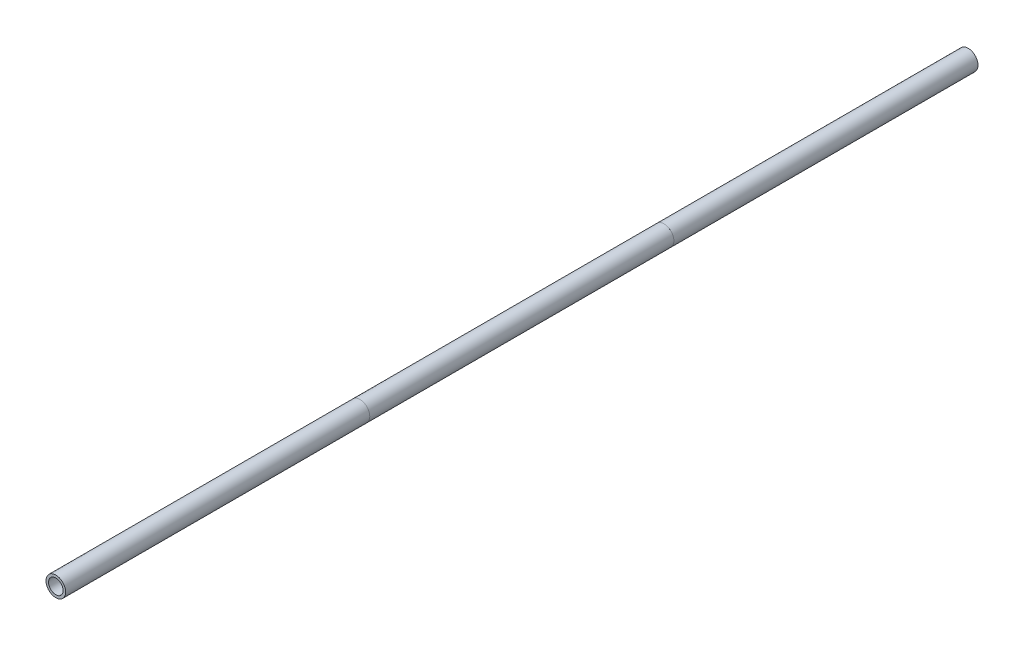
ISO-10303-21;
HEADER;
FILE_DESCRIPTION(('STEP AP214'),'2;1');
FILE_NAME('part.step','',(''),(''),'','','');
FILE_SCHEMA(('AUTOMOTIVE_DESIGN { 1 0 10303 214 1 1 1 1 }'));
ENDSEC;
DATA;
#1=APPLICATION_CONTEXT('core data for automotive mechanical design processes');
#2=APPLICATION_PROTOCOL_DEFINITION('international standard','automotive_design',2000,#1);
#3=PRODUCT_CONTEXT('',#1,'mechanical');
#4=PRODUCT('Part','Part','',(#3));
#5=PRODUCT_RELATED_PRODUCT_CATEGORY('part','',(#4));
#6=PRODUCT_DEFINITION_FORMATION('','',#4);
#7=PRODUCT_DEFINITION_CONTEXT('part definition',#1,'design');
#8=PRODUCT_DEFINITION('design','',#6,#7);
#9=PRODUCT_DEFINITION_SHAPE('','',#8);
#10=(LENGTH_UNIT() NAMED_UNIT(*) SI_UNIT(.MILLI.,.METRE.));
#11=(NAMED_UNIT(*) PLANE_ANGLE_UNIT() SI_UNIT($,.RADIAN.));
#12=(NAMED_UNIT(*) SI_UNIT($,.STERADIAN.) SOLID_ANGLE_UNIT());
#13=UNCERTAINTY_MEASURE_WITH_UNIT(LENGTH_MEASURE(1.E-05),#10,'distance_accuracy_value','');
#14=(GEOMETRIC_REPRESENTATION_CONTEXT(3) GLOBAL_UNCERTAINTY_ASSIGNED_CONTEXT((#13)) GLOBAL_UNIT_ASSIGNED_CONTEXT((#10,
#11,#12)) REPRESENTATION_CONTEXT('',''));
#15=CARTESIAN_POINT('',(0.,0.,0.));
#16=DIRECTION('',(0.,0.,1.));
#17=DIRECTION('',(1.,0.,0.));
#18=AXIS2_PLACEMENT_3D('',#15,#16,#17);
#19=CARTESIAN_POINT('',(0.,0.,-495.));
#20=DIRECTION('',(0.,0.,-1.));
#21=DIRECTION('',(-1.,0.,0.));
#22=AXIS2_PLACEMENT_3D('',#19,#20,#21);
#23=PLANE('',#22);
#24=CARTESIAN_POINT('',(0.,0.,-495.));
#25=DIRECTION('',(0.,0.,-1.));
#26=DIRECTION('',(-1.,0.,0.));
#27=AXIS2_PLACEMENT_3D('',#24,#25,#26);
#28=CIRCLE('',#27,10.668);
#29=CARTESIAN_POINT('',(-10.668,0.,-495.));
#30=VERTEX_POINT('',#29);
#31=EDGE_CURVE('E12',#30,#30,#28,.T.);
#32=ORIENTED_EDGE('',*,*,#31,.T.);
#33=EDGE_LOOP('',(#32));
#34=FACE_BOUND('',#33,.T.);
#35=CARTESIAN_POINT('',(0.,0.,-495.));
#36=DIRECTION('',(0.,0.,-1.));
#37=DIRECTION('',(-1.,0.,0.));
#38=AXIS2_PLACEMENT_3D('',#35,#36,#37);
#39=CIRCLE('',#38,7.8994);
#40=CARTESIAN_POINT('',(-7.8994,0.,-495.));
#41=VERTEX_POINT('',#40);
#42=EDGE_CURVE('E65',#41,#41,#39,.T.);
#43=ORIENTED_EDGE('',*,*,#42,.F.);
#44=EDGE_LOOP('',(#43));
#45=FACE_BOUND('',#44,.T.);
#46=ADVANCED_FACE('F54',(#34,#45),#23,.T.);
#47=CARTESIAN_POINT('',(0.,0.,-165.));
#48=DIRECTION('',(0.,0.,-1.));
#49=DIRECTION('',(-1.,0.,0.));
#50=AXIS2_PLACEMENT_3D('',#47,#48,#49);
#51=PLANE('',#50);
#52=CARTESIAN_POINT('',(0.,0.,-165.));
#53=DIRECTION('',(0.,0.,-1.));
#54=DIRECTION('',(-1.,0.,0.));
#55=AXIS2_PLACEMENT_3D('',#52,#53,#54);
#56=CIRCLE('',#55,10.668);
#57=CARTESIAN_POINT('',(-10.668,0.,-165.));
#58=VERTEX_POINT('',#57);
#59=EDGE_CURVE('E58',#58,#58,#56,.T.);
#60=ORIENTED_EDGE('',*,*,#59,.F.);
#61=EDGE_LOOP('',(#60));
#62=FACE_BOUND('',#61,.T.);
#63=CARTESIAN_POINT('',(0.,0.,-165.));
#64=DIRECTION('',(0.,0.,-1.));
#65=DIRECTION('',(-1.,0.,0.));
#66=AXIS2_PLACEMENT_3D('',#63,#64,#65);
#67=CIRCLE('',#66,7.8994);
#68=CARTESIAN_POINT('',(-7.8994,0.,-165.));
#69=VERTEX_POINT('',#68);
#70=EDGE_CURVE('E67',#69,#69,#67,.T.);
#71=ORIENTED_EDGE('',*,*,#70,.T.);
#72=EDGE_LOOP('',(#71));
#73=FACE_BOUND('',#72,.T.);
#74=ADVANCED_FACE('F77',(#62,#73),#51,.F.);
#75=CARTESIAN_POINT('',(0.,0.,-495.));
#76=DIRECTION('',(0.,0.,1.));
#77=DIRECTION('',(1.,0.,0.));
#78=AXIS2_PLACEMENT_3D('',#75,#76,#77);
#79=CYLINDRICAL_SURFACE('',#78,10.668);
#80=ORIENTED_EDGE('',*,*,#31,.F.);
#81=EDGE_LOOP('',(#80));
#82=FACE_BOUND('',#81,.T.);
#83=ORIENTED_EDGE('',*,*,#59,.T.);
#84=EDGE_LOOP('',(#83));
#85=FACE_BOUND('',#84,.T.);
#86=ADVANCED_FACE('F56',(#82,#85),#79,.T.);
#87=CARTESIAN_POINT('',(0.,0.,-495.));
#88=DIRECTION('',(0.,0.,1.));
#89=DIRECTION('',(1.,0.,0.));
#90=AXIS2_PLACEMENT_3D('',#87,#88,#89);
#91=CYLINDRICAL_SURFACE('',#90,7.8994);
#92=ORIENTED_EDGE('',*,*,#42,.T.);
#93=EDGE_LOOP('',(#92));
#94=FACE_BOUND('',#93,.T.);
#95=ORIENTED_EDGE('',*,*,#70,.F.);
#96=EDGE_LOOP('',(#95));
#97=FACE_BOUND('',#96,.T.);
#98=ADVANCED_FACE('F73',(#94,#97),#91,.F.);
#99=CLOSED_SHELL('',(#46,#74,#86,#98));
#100=MANIFOLD_SOLID_BREP('B2',#99);
#101=CARTESIAN_POINT('',(0.,0.,495.));
#102=DIRECTION('',(0.,0.,1.));
#103=DIRECTION('',(1.,0.,0.));
#104=AXIS2_PLACEMENT_3D('',#101,#102,#103);
#105=PLANE('',#104);
#106=CARTESIAN_POINT('',(0.,0.,495.));
#107=DIRECTION('',(0.,0.,1.));
#108=DIRECTION('',(1.,0.,0.));
#109=AXIS2_PLACEMENT_3D('',#106,#107,#108);
#110=CIRCLE('',#109,10.668);
#111=CARTESIAN_POINT('',(10.668,0.,495.));
#112=VERTEX_POINT('',#111);
#113=EDGE_CURVE('E53',#112,#112,#110,.T.);
#114=ORIENTED_EDGE('',*,*,#113,.T.);
#115=EDGE_LOOP('',(#114));
#116=FACE_BOUND('',#115,.T.);
#117=CARTESIAN_POINT('',(0.,0.,495.));
#118=DIRECTION('',(0.,0.,1.));
#119=DIRECTION('',(1.,0.,0.));
#120=AXIS2_PLACEMENT_3D('',#117,#118,#119);
#121=CIRCLE('',#120,7.8994);
#122=CARTESIAN_POINT('',(7.8994,0.,495.));
#123=VERTEX_POINT('',#122);
#124=EDGE_CURVE('E136',#123,#123,#121,.T.);
#125=ORIENTED_EDGE('',*,*,#124,.F.);
#126=EDGE_LOOP('',(#125));
#127=FACE_BOUND('',#126,.T.);
#128=ADVANCED_FACE('F123',(#116,#127),#105,.T.);
#129=CARTESIAN_POINT('',(0.,0.,165.));
#130=DIRECTION('',(0.,0.,1.));
#131=DIRECTION('',(1.,0.,0.));
#132=AXIS2_PLACEMENT_3D('',#129,#130,#131);
#133=PLANE('',#132);
#134=CARTESIAN_POINT('',(0.,0.,165.));
#135=DIRECTION('',(0.,0.,1.));
#136=DIRECTION('',(1.,0.,0.));
#137=AXIS2_PLACEMENT_3D('',#134,#135,#136);
#138=CIRCLE('',#137,10.668);
#139=CARTESIAN_POINT('',(10.668,0.,165.));
#140=VERTEX_POINT('',#139);
#141=EDGE_CURVE('E127',#140,#140,#138,.T.);
#142=ORIENTED_EDGE('',*,*,#141,.F.);
#143=EDGE_LOOP('',(#142));
#144=FACE_BOUND('',#143,.T.);
#145=CARTESIAN_POINT('',(0.,0.,165.));
#146=DIRECTION('',(0.,0.,1.));
#147=DIRECTION('',(1.,0.,0.));
#148=AXIS2_PLACEMENT_3D('',#145,#146,#147);
#149=CIRCLE('',#148,7.8994);
#150=CARTESIAN_POINT('',(7.8994,0.,165.));
#151=VERTEX_POINT('',#150);
#152=EDGE_CURVE('E138',#151,#151,#149,.T.);
#153=ORIENTED_EDGE('',*,*,#152,.T.);
#154=EDGE_LOOP('',(#153));
#155=FACE_BOUND('',#154,.T.);
#156=ADVANCED_FACE('F150',(#144,#155),#133,.F.);
#157=CARTESIAN_POINT('',(0.,0.,495.));
#158=DIRECTION('',(0.,0.,-1.));
#159=DIRECTION('',(-1.,0.,0.));
#160=AXIS2_PLACEMENT_3D('',#157,#158,#159);
#161=CYLINDRICAL_SURFACE('',#160,10.668);
#162=ORIENTED_EDGE('',*,*,#113,.F.);
#163=EDGE_LOOP('',(#162));
#164=FACE_BOUND('',#163,.T.);
#165=ORIENTED_EDGE('',*,*,#141,.T.);
#166=EDGE_LOOP('',(#165));
#167=FACE_BOUND('',#166,.T.);
#168=ADVANCED_FACE('F125',(#164,#167),#161,.T.);
#169=CARTESIAN_POINT('',(0.,0.,495.));
#170=DIRECTION('',(0.,0.,-1.));
#171=DIRECTION('',(-1.,0.,0.));
#172=AXIS2_PLACEMENT_3D('',#169,#170,#171);
#173=CYLINDRICAL_SURFACE('',#172,7.8994);
#174=ORIENTED_EDGE('',*,*,#124,.T.);
#175=EDGE_LOOP('',(#174));
#176=FACE_BOUND('',#175,.T.);
#177=ORIENTED_EDGE('',*,*,#152,.F.);
#178=EDGE_LOOP('',(#177));
#179=FACE_BOUND('',#178,.T.);
#180=ADVANCED_FACE('F146',(#176,#179),#173,.F.);
#181=CLOSED_SHELL('',(#128,#156,#168,#180));
#182=MANIFOLD_SOLID_BREP('B7',#181);
#183=CARTESIAN_POINT('',(0.,0.,165.));
#184=DIRECTION('',(0.,0.,1.));
#185=DIRECTION('',(1.,0.,0.));
#186=AXIS2_PLACEMENT_3D('',#183,#184,#185);
#187=PLANE('',#186);
#188=CARTESIAN_POINT('',(0.,0.,165.));
#189=DIRECTION('',(0.,0.,1.));
#190=DIRECTION('',(1.,0.,0.));
#191=AXIS2_PLACEMENT_3D('',#188,#189,#190);
#192=CIRCLE('',#191,10.668);
#193=CARTESIAN_POINT('',(10.668,0.,165.));
#194=VERTEX_POINT('',#193);
#195=EDGE_CURVE('E122',#194,#194,#192,.T.);
#196=ORIENTED_EDGE('',*,*,#195,.T.);
#197=EDGE_LOOP('',(#196));
#198=FACE_BOUND('',#197,.T.);
#199=CARTESIAN_POINT('',(0.,0.,165.));
#200=DIRECTION('',(0.,0.,1.));
#201=DIRECTION('',(1.,0.,0.));
#202=AXIS2_PLACEMENT_3D('',#199,#200,#201);
#203=CIRCLE('',#202,7.8994);
#204=CARTESIAN_POINT('',(7.8994,0.,165.));
#205=VERTEX_POINT('',#204);
#206=EDGE_CURVE('E200',#205,#205,#203,.T.);
#207=ORIENTED_EDGE('',*,*,#206,.F.);
#208=EDGE_LOOP('',(#207));
#209=FACE_BOUND('',#208,.T.);
#210=ADVANCED_FACE('F189',(#198,#209),#187,.T.);
#211=CARTESIAN_POINT('',(0.,0.,-165.));
#212=DIRECTION('',(0.,0.,1.));
#213=DIRECTION('',(1.,0.,0.));
#214=AXIS2_PLACEMENT_3D('',#211,#212,#213);
#215=PLANE('',#214);
#216=CARTESIAN_POINT('',(0.,0.,-165.));
#217=DIRECTION('',(0.,0.,1.));
#218=DIRECTION('',(1.,0.,0.));
#219=AXIS2_PLACEMENT_3D('',#216,#217,#218);
#220=CIRCLE('',#219,10.668);
#221=CARTESIAN_POINT('',(10.668,0.,-165.));
#222=VERTEX_POINT('',#221);
#223=EDGE_CURVE('E193',#222,#222,#220,.T.);
#224=ORIENTED_EDGE('',*,*,#223,.F.);
#225=EDGE_LOOP('',(#224));
#226=FACE_BOUND('',#225,.T.);
#227=CARTESIAN_POINT('',(0.,0.,-165.));
#228=DIRECTION('',(0.,0.,1.));
#229=DIRECTION('',(1.,0.,0.));
#230=AXIS2_PLACEMENT_3D('',#227,#228,#229);
#231=CIRCLE('',#230,7.8994);
#232=CARTESIAN_POINT('',(7.8994,0.,-165.));
#233=VERTEX_POINT('',#232);
#234=EDGE_CURVE('E202',#233,#233,#231,.T.);
#235=ORIENTED_EDGE('',*,*,#234,.T.);
#236=EDGE_LOOP('',(#235));
#237=FACE_BOUND('',#236,.T.);
#238=ADVANCED_FACE('F212',(#226,#237),#215,.F.);
#239=CARTESIAN_POINT('',(0.,0.,165.));
#240=DIRECTION('',(0.,0.,-1.));
#241=DIRECTION('',(-1.,0.,0.));
#242=AXIS2_PLACEMENT_3D('',#239,#240,#241);
#243=CYLINDRICAL_SURFACE('',#242,10.668);
#244=ORIENTED_EDGE('',*,*,#195,.F.);
#245=EDGE_LOOP('',(#244));
#246=FACE_BOUND('',#245,.T.);
#247=ORIENTED_EDGE('',*,*,#223,.T.);
#248=EDGE_LOOP('',(#247));
#249=FACE_BOUND('',#248,.T.);
#250=ADVANCED_FACE('F191',(#246,#249),#243,.T.);
#251=CARTESIAN_POINT('',(0.,0.,165.));
#252=DIRECTION('',(0.,0.,-1.));
#253=DIRECTION('',(-1.,0.,0.));
#254=AXIS2_PLACEMENT_3D('',#251,#252,#253);
#255=CYLINDRICAL_SURFACE('',#254,7.8994);
#256=ORIENTED_EDGE('',*,*,#206,.T.);
#257=EDGE_LOOP('',(#256));
#258=FACE_BOUND('',#257,.T.);
#259=ORIENTED_EDGE('',*,*,#234,.F.);
#260=EDGE_LOOP('',(#259));
#261=FACE_BOUND('',#260,.T.);
#262=ADVANCED_FACE('F208',(#258,#261),#255,.F.);
#263=CLOSED_SHELL('',(#210,#238,#250,#262));
#264=MANIFOLD_SOLID_BREP('B48',#263);
#265=ADVANCED_BREP_SHAPE_REPRESENTATION('',(#18,#100,#182,#264),#14);
#266=SHAPE_DEFINITION_REPRESENTATION(#9,#265);
ENDSEC;
END-ISO-10303-21;
